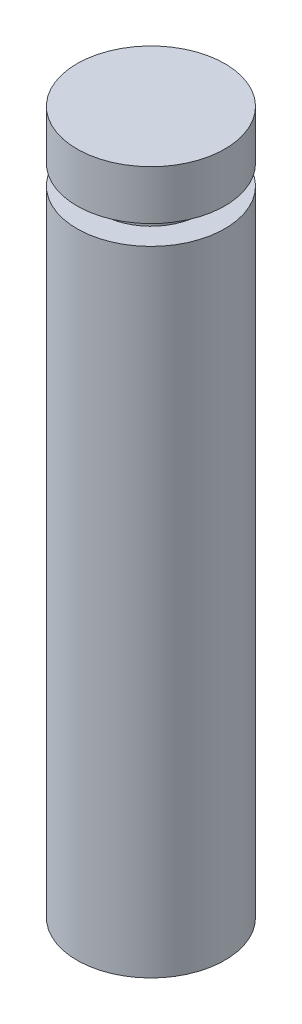
ISO-10303-21;
HEADER;
FILE_DESCRIPTION(('STEP AP214'),'2;1');
FILE_NAME('part.step','',(''),(''),'','','');
FILE_SCHEMA(('AUTOMOTIVE_DESIGN { 1 0 10303 214 1 1 1 1 }'));
ENDSEC;
DATA;
#1=APPLICATION_CONTEXT('core data for automotive mechanical design processes');
#2=APPLICATION_PROTOCOL_DEFINITION('international standard','automotive_design',2000,#1);
#3=PRODUCT_CONTEXT('',#1,'mechanical');
#4=PRODUCT('Part','Part','',(#3));
#5=PRODUCT_RELATED_PRODUCT_CATEGORY('part','',(#4));
#6=PRODUCT_DEFINITION_FORMATION('','',#4);
#7=PRODUCT_DEFINITION_CONTEXT('part definition',#1,'design');
#8=PRODUCT_DEFINITION('design','',#6,#7);
#9=PRODUCT_DEFINITION_SHAPE('','',#8);
#10=(LENGTH_UNIT() NAMED_UNIT(*) SI_UNIT(.MILLI.,.METRE.));
#11=(NAMED_UNIT(*) PLANE_ANGLE_UNIT() SI_UNIT($,.RADIAN.));
#12=(NAMED_UNIT(*) SI_UNIT($,.STERADIAN.) SOLID_ANGLE_UNIT());
#13=UNCERTAINTY_MEASURE_WITH_UNIT(LENGTH_MEASURE(1.E-05),#10,'distance_accuracy_value','');
#14=(GEOMETRIC_REPRESENTATION_CONTEXT(3) GLOBAL_UNCERTAINTY_ASSIGNED_CONTEXT((#13)) GLOBAL_UNIT_ASSIGNED_CONTEXT((#10,
#11,#12)) REPRESENTATION_CONTEXT('',''));
#15=CARTESIAN_POINT('',(0.,0.,0.));
#16=DIRECTION('',(0.,0.,1.));
#17=DIRECTION('',(1.,0.,0.));
#18=AXIS2_PLACEMENT_3D('',#15,#16,#17);
#19=CARTESIAN_POINT('',(0.,0.,0.));
#20=DIRECTION('',(0.,1.,0.));
#21=DIRECTION('',(-1.,0.,0.));
#22=AXIS2_PLACEMENT_3D('',#19,#20,#21);
#23=PLANE('',#22);
#24=CARTESIAN_POINT('',(0.,0.,0.));
#25=DIRECTION('',(0.,1.,0.));
#26=DIRECTION('',(-1.,0.,0.));
#27=AXIS2_PLACEMENT_3D('',#24,#25,#26);
#28=CIRCLE('',#27,3.);
#29=CARTESIAN_POINT('',(-3.,0.,0.));
#30=VERTEX_POINT('',#29);
#31=EDGE_CURVE('E10',#30,#30,#28,.T.);
#32=ORIENTED_EDGE('',*,*,#31,.F.);
#33=EDGE_LOOP('',(#32));
#34=FACE_BOUND('',#33,.T.);
#35=ADVANCED_FACE('F43',(#34),#23,.F.);
#36=CARTESIAN_POINT('',(0.,28.5,0.));
#37=DIRECTION('',(0.,1.,0.));
#38=DIRECTION('',(-1.,0.,0.));
#39=AXIS2_PLACEMENT_3D('',#36,#37,#38);
#40=CYLINDRICAL_SURFACE('',#39,3.);
#41=CARTESIAN_POINT('',(0.,25.7,0.));
#42=DIRECTION('',(0.,1.,0.));
#43=DIRECTION('',(-1.,0.,0.));
#44=AXIS2_PLACEMENT_3D('',#41,#42,#43);
#45=CIRCLE('',#44,3.);
#46=CARTESIAN_POINT('',(-3.,25.7,0.));
#47=VERTEX_POINT('',#46);
#48=EDGE_CURVE('E50',#47,#47,#45,.T.);
#49=ORIENTED_EDGE('',*,*,#48,.F.);
#50=EDGE_LOOP('',(#49));
#51=FACE_BOUND('',#50,.T.);
#52=ORIENTED_EDGE('',*,*,#31,.T.);
#53=EDGE_LOOP('',(#52));
#54=FACE_BOUND('',#53,.T.);
#55=ADVANCED_FACE('F97',(#51,#54),#40,.T.);
#56=CARTESIAN_POINT('',(3.,25.7,0.));
#57=DIRECTION('',(0.,-1.,0.));
#58=DIRECTION('',(1.,0.,0.));
#59=AXIS2_PLACEMENT_3D('',#56,#57,#58);
#60=PLANE('',#59);
#61=CARTESIAN_POINT('',(0.,25.7,0.));
#62=DIRECTION('',(0.,1.,0.));
#63=DIRECTION('',(-1.,0.,0.));
#64=AXIS2_PLACEMENT_3D('',#61,#62,#63);
#65=CIRCLE('',#64,2.);
#66=CARTESIAN_POINT('',(-2.,25.7,0.));
#67=VERTEX_POINT('',#66);
#68=EDGE_CURVE('E55',#67,#67,#65,.T.);
#69=ORIENTED_EDGE('',*,*,#68,.F.);
#70=EDGE_LOOP('',(#69));
#71=FACE_BOUND('',#70,.T.);
#72=ORIENTED_EDGE('',*,*,#48,.T.);
#73=EDGE_LOOP('',(#72));
#74=FACE_BOUND('',#73,.T.);
#75=ADVANCED_FACE('F92',(#71,#74),#60,.F.);
#76=CARTESIAN_POINT('',(0.,28.5,0.));
#77=DIRECTION('',(0.,1.,0.));
#78=DIRECTION('',(-1.,0.,0.));
#79=AXIS2_PLACEMENT_3D('',#76,#77,#78);
#80=CYLINDRICAL_SURFACE('',#79,2.);
#81=CARTESIAN_POINT('',(0.,26.5,0.));
#82=DIRECTION('',(0.,1.,0.));
#83=DIRECTION('',(-1.,0.,0.));
#84=AXIS2_PLACEMENT_3D('',#81,#82,#83);
#85=CIRCLE('',#84,2.);
#86=CARTESIAN_POINT('',(-2.,26.5,0.));
#87=VERTEX_POINT('',#86);
#88=EDGE_CURVE('E60',#87,#87,#85,.T.);
#89=ORIENTED_EDGE('',*,*,#88,.F.);
#90=EDGE_LOOP('',(#89));
#91=FACE_BOUND('',#90,.T.);
#92=ORIENTED_EDGE('',*,*,#68,.T.);
#93=EDGE_LOOP('',(#92));
#94=FACE_BOUND('',#93,.T.);
#95=ADVANCED_FACE('F86',(#91,#94),#80,.T.);
#96=CARTESIAN_POINT('',(2.,26.5,0.));
#97=DIRECTION('',(0.,1.,0.));
#98=DIRECTION('',(-1.,0.,0.));
#99=AXIS2_PLACEMENT_3D('',#96,#97,#98);
#100=PLANE('',#99);
#101=CARTESIAN_POINT('',(0.,26.5,0.));
#102=DIRECTION('',(0.,1.,0.));
#103=DIRECTION('',(-1.,0.,0.));
#104=AXIS2_PLACEMENT_3D('',#101,#102,#103);
#105=CIRCLE('',#104,3.);
#106=CARTESIAN_POINT('',(-3.,26.5,0.));
#107=VERTEX_POINT('',#106);
#108=EDGE_CURVE('E66',#107,#107,#105,.T.);
#109=ORIENTED_EDGE('',*,*,#108,.F.);
#110=EDGE_LOOP('',(#109));
#111=FACE_BOUND('',#110,.T.);
#112=ORIENTED_EDGE('',*,*,#88,.T.);
#113=EDGE_LOOP('',(#112));
#114=FACE_BOUND('',#113,.T.);
#115=ADVANCED_FACE('F80',(#111,#114),#100,.F.);
#116=CARTESIAN_POINT('',(0.,28.5,0.));
#117=DIRECTION('',(0.,1.,0.));
#118=DIRECTION('',(-1.,0.,0.));
#119=AXIS2_PLACEMENT_3D('',#116,#117,#118);
#120=CYLINDRICAL_SURFACE('',#119,3.);
#121=CARTESIAN_POINT('',(0.,28.5,0.));
#122=DIRECTION('',(0.,1.,0.));
#123=DIRECTION('',(-1.,0.,0.));
#124=AXIS2_PLACEMENT_3D('',#121,#122,#123);
#125=CIRCLE('',#124,3.);
#126=CARTESIAN_POINT('',(-3.,28.5,0.));
#127=VERTEX_POINT('',#126);
#128=EDGE_CURVE('E70',#127,#127,#125,.T.);
#129=ORIENTED_EDGE('',*,*,#128,.F.);
#130=EDGE_LOOP('',(#129));
#131=FACE_BOUND('',#130,.T.);
#132=ORIENTED_EDGE('',*,*,#108,.T.);
#133=EDGE_LOOP('',(#132));
#134=FACE_BOUND('',#133,.T.);
#135=ADVANCED_FACE('F77',(#131,#134),#120,.T.);
#136=CARTESIAN_POINT('',(3.,28.5,0.));
#137=DIRECTION('',(0.,-1.,0.));
#138=DIRECTION('',(1.,0.,0.));
#139=AXIS2_PLACEMENT_3D('',#136,#137,#138);
#140=PLANE('',#139);
#141=ORIENTED_EDGE('',*,*,#128,.T.);
#142=EDGE_LOOP('',(#141));
#143=FACE_BOUND('',#142,.T.);
#144=ADVANCED_FACE('F75',(#143),#140,.F.);
#145=CLOSED_SHELL('',(#35,#55,#75,#95,#115,#135,#144));
#146=MANIFOLD_SOLID_BREP('B2',#145);
#147=ADVANCED_BREP_SHAPE_REPRESENTATION('',(#18,#146),#14);
#148=SHAPE_DEFINITION_REPRESENTATION(#9,#147);
ENDSEC;
END-ISO-10303-21;
